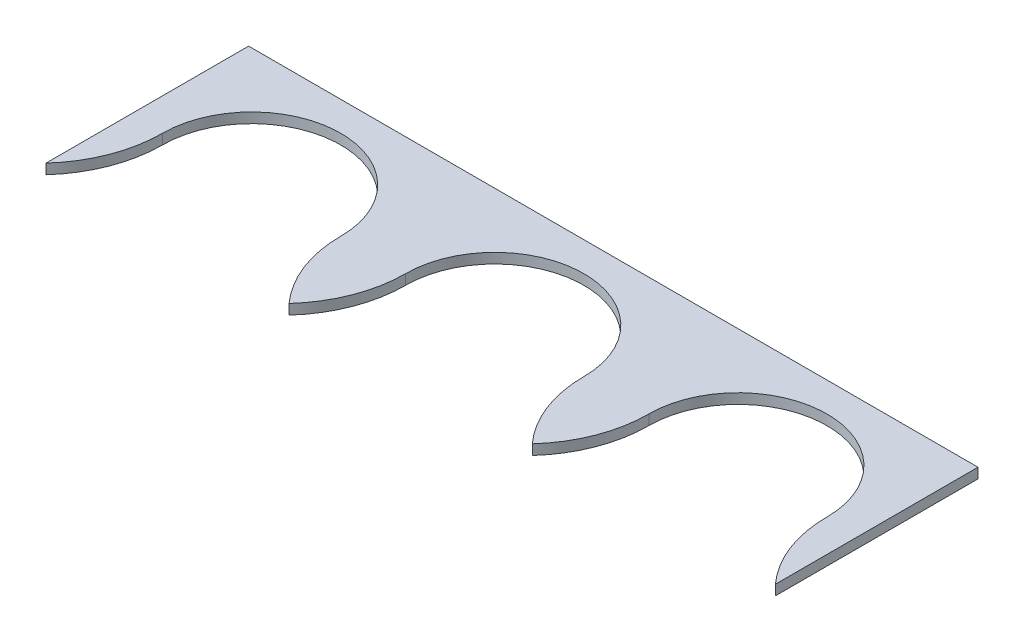
ISO-10303-21;
HEADER;
FILE_DESCRIPTION(('STEP AP214'),'2;1');
FILE_NAME('part.step','',(''),(''),'','','');
FILE_SCHEMA(('AUTOMOTIVE_DESIGN { 1 0 10303 214 1 1 1 1 }'));
ENDSEC;
DATA;
#1=APPLICATION_CONTEXT('core data for automotive mechanical design processes');
#2=APPLICATION_PROTOCOL_DEFINITION('international standard','automotive_design',2000,#1);
#3=PRODUCT_CONTEXT('',#1,'mechanical');
#4=PRODUCT('Part','Part','',(#3));
#5=PRODUCT_RELATED_PRODUCT_CATEGORY('part','',(#4));
#6=PRODUCT_DEFINITION_FORMATION('','',#4);
#7=PRODUCT_DEFINITION_CONTEXT('part definition',#1,'design');
#8=PRODUCT_DEFINITION('design','',#6,#7);
#9=PRODUCT_DEFINITION_SHAPE('','',#8);
#10=(LENGTH_UNIT() NAMED_UNIT(*) SI_UNIT(.MILLI.,.METRE.));
#11=(NAMED_UNIT(*) PLANE_ANGLE_UNIT() SI_UNIT($,.RADIAN.));
#12=(NAMED_UNIT(*) SI_UNIT($,.STERADIAN.) SOLID_ANGLE_UNIT());
#13=UNCERTAINTY_MEASURE_WITH_UNIT(LENGTH_MEASURE(1.E-05),#10,'distance_accuracy_value','');
#14=(GEOMETRIC_REPRESENTATION_CONTEXT(3) GLOBAL_UNCERTAINTY_ASSIGNED_CONTEXT((#13)) GLOBAL_UNIT_ASSIGNED_CONTEXT((#10,
#11,#12)) REPRESENTATION_CONTEXT('',''));
#15=CARTESIAN_POINT('',(0.,0.,0.));
#16=DIRECTION('',(0.,0.,1.));
#17=DIRECTION('',(1.,0.,0.));
#18=AXIS2_PLACEMENT_3D('',#15,#16,#17);
#19=CARTESIAN_POINT('',(-44.2941712464759,-6.35,34.3739942350874));
#20=DIRECTION('',(0.,1.,0.));
#21=DIRECTION('',(0.,0.,1.));
#22=AXIS2_PLACEMENT_3D('',#19,#20,#21);
#23=CYLINDRICAL_SURFACE('',#22,55.88);
#24=CARTESIAN_POINT('',(-44.2941712464759,0.,34.3739942350874));
#25=DIRECTION('',(0.,1.,0.));
#26=DIRECTION('',(0.,0.,1.));
#27=AXIS2_PLACEMENT_3D('',#24,#25,#26);
#28=CIRCLE('',#27,55.88);
#29=CARTESIAN_POINT('',(11.5858287535241,0.,34.3739942350875));
#30=VERTEX_POINT('',#29);
#31=CARTESIAN_POINT('',(-100.174171246476,0.,34.3739942350874));
#32=VERTEX_POINT('',#31);
#33=EDGE_CURVE('E153',#30,#32,#28,.T.);
#34=ORIENTED_EDGE('',*,*,#33,.T.);
#35=DIRECTION('',(0.,1.,0.));
#36=VECTOR('',#35,1.);
#37=CARTESIAN_POINT('',(-100.174171246476,-6.35,34.3739942350874));
#38=LINE('',#37,#36);
#39=CARTESIAN_POINT('',(-100.174171246476,-6.35,34.3739942350874));
#40=VERTEX_POINT('',#39);
#41=EDGE_CURVE('E11',#40,#32,#38,.T.);
#42=ORIENTED_EDGE('',*,*,#41,.F.);
#43=CARTESIAN_POINT('',(-44.2941712464759,-6.35,34.3739942350874));
#44=DIRECTION('',(0.,1.,0.));
#45=DIRECTION('',(0.,0.,1.));
#46=AXIS2_PLACEMENT_3D('',#43,#44,#45);
#47=CIRCLE('',#46,55.88);
#48=CARTESIAN_POINT('',(11.5858287535241,-6.35,34.3739942350875));
#49=VERTEX_POINT('',#48);
#50=EDGE_CURVE('E181',#49,#40,#47,.T.);
#51=ORIENTED_EDGE('',*,*,#50,.F.);
#52=DIRECTION('',(0.,1.,0.));
#53=VECTOR('',#52,1.);
#54=CARTESIAN_POINT('',(11.5858287535241,-6.35,34.3739942350875));
#55=LINE('',#54,#53);
#56=EDGE_CURVE('E38',#49,#30,#55,.T.);
#57=ORIENTED_EDGE('',*,*,#56,.T.);
#58=EDGE_LOOP('',(#34,#42,#51,#57));
#59=FACE_BOUND('',#58,.T.);
#60=ADVANCED_FACE('F35',(#59),#23,.F.);
#61=CARTESIAN_POINT('',(-178.685968121476,-6.35,34.3739942350874));
#62=DIRECTION('',(0.,1.,0.));
#63=DIRECTION('',(0.,0.,1.));
#64=AXIS2_PLACEMENT_3D('',#61,#62,#63);
#65=CYLINDRICAL_SURFACE('',#64,78.5117968749999);
#66=CARTESIAN_POINT('',(-178.685968121476,0.,34.3739942350874));
#67=DIRECTION('',(0.,1.,0.));
#68=DIRECTION('',(0.,0.,1.));
#69=AXIS2_PLACEMENT_3D('',#66,#67,#68);
#70=CIRCLE('',#69,78.5117968749999);
#71=CARTESIAN_POINT('',(-120.494171246476,0.,87.0789942350874));
#72=VERTEX_POINT('',#71);
#73=EDGE_CURVE('E98',#32,#72,#70,.F.);
#74=ORIENTED_EDGE('',*,*,#73,.T.);
#75=DIRECTION('',(0.,1.,0.));
#76=VECTOR('',#75,1.);
#77=CARTESIAN_POINT('',(-120.494171246476,-6.35,87.0789942350874));
#78=LINE('',#77,#76);
#79=CARTESIAN_POINT('',(-120.494171246476,-6.35,87.0789942350874));
#80=VERTEX_POINT('',#79);
#81=EDGE_CURVE('E44',#80,#72,#78,.T.);
#82=ORIENTED_EDGE('',*,*,#81,.F.);
#83=CARTESIAN_POINT('',(-178.685968121476,-6.35,34.3739942350874));
#84=DIRECTION('',(0.,1.,0.));
#85=DIRECTION('',(0.,0.,1.));
#86=AXIS2_PLACEMENT_3D('',#83,#84,#85);
#87=CIRCLE('',#86,78.5117968749999);
#88=EDGE_CURVE('E52',#40,#80,#87,.F.);
#89=ORIENTED_EDGE('',*,*,#88,.F.);
#90=ORIENTED_EDGE('',*,*,#41,.T.);
#91=EDGE_LOOP('',(#74,#82,#89,#90));
#92=FACE_BOUND('',#91,.T.);
#93=ADVANCED_FACE('F217',(#92),#65,.T.);
#94=CARTESIAN_POINT('',(-120.494171246476,-6.35,25.1664942350875));
#95=DIRECTION('',(-1.,0.,0.));
#96=DIRECTION('',(0.,0.,1.));
#97=AXIS2_PLACEMENT_3D('',#94,#95,#96);
#98=PLANE('',#97);
#99=DIRECTION('',(0.,0.,1.));
#100=VECTOR('',#99,1.);
#101=CARTESIAN_POINT('',(-120.494171246476,0.,25.1664942350875));
#102=LINE('',#101,#100);
#103=CARTESIAN_POINT('',(-120.494171246476,0.,-39.9210057649125));
#104=VERTEX_POINT('',#103);
#105=EDGE_CURVE('E135',#104,#72,#102,.T.);
#106=ORIENTED_EDGE('',*,*,#105,.F.);
#107=DIRECTION('',(0.,1.,0.));
#108=VECTOR('',#107,1.);
#109=CARTESIAN_POINT('',(-120.494171246476,-6.35,-39.9210057649125));
#110=LINE('',#109,#108);
#111=CARTESIAN_POINT('',(-120.494171246476,-6.35,-39.9210057649125));
#112=VERTEX_POINT('',#111);
#113=EDGE_CURVE('E130',#112,#104,#110,.T.);
#114=ORIENTED_EDGE('',*,*,#113,.F.);
#115=DIRECTION('',(0.,0.,1.));
#116=VECTOR('',#115,1.);
#117=CARTESIAN_POINT('',(-120.494171246476,-6.35,25.1664942350875));
#118=LINE('',#117,#116);
#119=EDGE_CURVE('E134',#112,#80,#118,.T.);
#120=ORIENTED_EDGE('',*,*,#119,.T.);
#121=ORIENTED_EDGE('',*,*,#81,.T.);
#122=EDGE_LOOP('',(#106,#114,#120,#121));
#123=FACE_BOUND('',#122,.T.);
#124=ADVANCED_FACE('F132',(#123),#98,.T.);
#125=CARTESIAN_POINT('',(-261.787278505733,-6.35,-39.9210057649125));
#126=DIRECTION('',(0.,0.,1.));
#127=DIRECTION('',(1.,0.,0.));
#128=AXIS2_PLACEMENT_3D('',#125,#126,#127);
#129=PLANE('',#128);
#130=DIRECTION('',(1.,0.,0.));
#131=VECTOR('',#130,1.);
#132=CARTESIAN_POINT('',(-261.787278505733,0.,-39.9210057649125));
#133=LINE('',#132,#131);
#134=CARTESIAN_POINT('',(336.705828753524,0.,-39.9210057649125));
#135=VERTEX_POINT('',#134);
#136=EDGE_CURVE('E178',#104,#135,#133,.T.);
#137=ORIENTED_EDGE('',*,*,#136,.T.);
#138=DIRECTION('',(0.,1.,0.));
#139=VECTOR('',#138,1.);
#140=CARTESIAN_POINT('',(336.705828753524,-6.35,-39.9210057649125));
#141=LINE('',#140,#139);
#142=CARTESIAN_POINT('',(336.705828753524,-6.35,-39.9210057649125));
#143=VERTEX_POINT('',#142);
#144=EDGE_CURVE('E138',#143,#135,#141,.T.);
#145=ORIENTED_EDGE('',*,*,#144,.F.);
#146=DIRECTION('',(1.,0.,0.));
#147=VECTOR('',#146,1.);
#148=CARTESIAN_POINT('',(-261.787278505733,-6.35,-39.9210057649125));
#149=LINE('',#148,#147);
#150=EDGE_CURVE('E141',#112,#143,#149,.T.);
#151=ORIENTED_EDGE('',*,*,#150,.F.);
#152=ORIENTED_EDGE('',*,*,#113,.T.);
#153=EDGE_LOOP('',(#137,#145,#151,#152));
#154=FACE_BOUND('',#153,.T.);
#155=ADVANCED_FACE('F142',(#154),#129,.F.);
#156=CARTESIAN_POINT('',(336.705828753524,-6.35,25.1664942350875));
#157=DIRECTION('',(-1.,0.,0.));
#158=DIRECTION('',(0.,0.,1.));
#159=AXIS2_PLACEMENT_3D('',#156,#157,#158);
#160=PLANE('',#159);
#161=DIRECTION('',(0.,0.,1.));
#162=VECTOR('',#161,1.);
#163=CARTESIAN_POINT('',(336.705828753524,0.,25.1664942350875));
#164=LINE('',#163,#162);
#165=CARTESIAN_POINT('',(336.705828753524,0.,87.0789942350875));
#166=VERTEX_POINT('',#165);
#167=EDGE_CURVE('E175',#135,#166,#164,.T.);
#168=ORIENTED_EDGE('',*,*,#167,.T.);
#169=DIRECTION('',(0.,1.,0.));
#170=VECTOR('',#169,1.);
#171=CARTESIAN_POINT('',(336.705828753524,-6.35,87.0789942350875));
#172=LINE('',#171,#170);
#173=CARTESIAN_POINT('',(336.705828753524,-6.35,87.0789942350875));
#174=VERTEX_POINT('',#173);
#175=EDGE_CURVE('E185',#174,#166,#172,.T.);
#176=ORIENTED_EDGE('',*,*,#175,.F.);
#177=DIRECTION('',(0.,0.,1.));
#178=VECTOR('',#177,1.);
#179=CARTESIAN_POINT('',(336.705828753524,-6.35,25.1664942350875));
#180=LINE('',#179,#178);
#181=EDGE_CURVE('E146',#143,#174,#180,.T.);
#182=ORIENTED_EDGE('',*,*,#181,.F.);
#183=ORIENTED_EDGE('',*,*,#144,.T.);
#184=EDGE_LOOP('',(#168,#176,#182,#183));
#185=FACE_BOUND('',#184,.T.);
#186=ADVANCED_FACE('F230',(#185),#160,.F.);
#187=CARTESIAN_POINT('',(394.897625628524,-6.35,34.3739942350875));
#188=DIRECTION('',(0.,1.,0.));
#189=DIRECTION('',(0.,0.,1.));
#190=AXIS2_PLACEMENT_3D('',#187,#188,#189);
#191=CYLINDRICAL_SURFACE('',#190,78.5117968750001);
#192=CARTESIAN_POINT('',(394.897625628524,0.,34.3739942350875));
#193=DIRECTION('',(0.,1.,0.));
#194=DIRECTION('',(0.,0.,1.));
#195=AXIS2_PLACEMENT_3D('',#192,#193,#194);
#196=CIRCLE('',#195,78.5117968750001);
#197=CARTESIAN_POINT('',(316.385828753524,0.,34.3739942350875));
#198=VERTEX_POINT('',#197);
#199=EDGE_CURVE('E172',#198,#166,#196,.T.);
#200=ORIENTED_EDGE('',*,*,#199,.F.);
#201=DIRECTION('',(0.,1.,0.));
#202=VECTOR('',#201,1.);
#203=CARTESIAN_POINT('',(316.385828753524,-6.35,34.3739942350875));
#204=LINE('',#203,#202);
#205=CARTESIAN_POINT('',(316.385828753524,-6.35,34.3739942350875));
#206=VERTEX_POINT('',#205);
#207=EDGE_CURVE('E187',#206,#198,#204,.T.);
#208=ORIENTED_EDGE('',*,*,#207,.F.);
#209=CARTESIAN_POINT('',(394.897625628524,-6.35,34.3739942350875));
#210=DIRECTION('',(0.,1.,0.));
#211=DIRECTION('',(0.,0.,1.));
#212=AXIS2_PLACEMENT_3D('',#209,#210,#211);
#213=CIRCLE('',#212,78.5117968750001);
#214=EDGE_CURVE('E274',#206,#174,#213,.T.);
#215=ORIENTED_EDGE('',*,*,#214,.T.);
#216=ORIENTED_EDGE('',*,*,#175,.T.);
#217=EDGE_LOOP('',(#200,#208,#215,#216));
#218=FACE_BOUND('',#217,.T.);
#219=ADVANCED_FACE('F233',(#218),#191,.T.);
#220=CARTESIAN_POINT('',(260.505828753524,-6.35,34.3739942350874));
#221=DIRECTION('',(0.,1.,0.));
#222=DIRECTION('',(0.,0.,1.));
#223=AXIS2_PLACEMENT_3D('',#220,#221,#222);
#224=CYLINDRICAL_SURFACE('',#223,55.88);
#225=CARTESIAN_POINT('',(260.505828753524,0.,34.3739942350874));
#226=DIRECTION('',(0.,1.,0.));
#227=DIRECTION('',(0.,0.,1.));
#228=AXIS2_PLACEMENT_3D('',#225,#226,#227);
#229=CIRCLE('',#228,55.88);
#230=CARTESIAN_POINT('',(204.625828753524,0.,34.3739942350874));
#231=VERTEX_POINT('',#230);
#232=EDGE_CURVE('E170',#198,#231,#229,.T.);
#233=ORIENTED_EDGE('',*,*,#232,.T.);
#234=DIRECTION('',(0.,1.,0.));
#235=VECTOR('',#234,1.);
#236=CARTESIAN_POINT('',(204.625828753524,-6.35,34.3739942350874));
#237=LINE('',#236,#235);
#238=CARTESIAN_POINT('',(204.625828753524,-6.35,34.3739942350874));
#239=VERTEX_POINT('',#238);
#240=EDGE_CURVE('E189',#239,#231,#237,.T.);
#241=ORIENTED_EDGE('',*,*,#240,.F.);
#242=CARTESIAN_POINT('',(260.505828753524,-6.35,34.3739942350874));
#243=DIRECTION('',(0.,1.,0.));
#244=DIRECTION('',(0.,0.,1.));
#245=AXIS2_PLACEMENT_3D('',#242,#243,#244);
#246=CIRCLE('',#245,55.88);
#247=EDGE_CURVE('E272',#206,#239,#246,.T.);
#248=ORIENTED_EDGE('',*,*,#247,.F.);
#249=ORIENTED_EDGE('',*,*,#207,.T.);
#250=EDGE_LOOP('',(#233,#241,#248,#249));
#251=FACE_BOUND('',#250,.T.);
#252=ADVANCED_FACE('F237',(#251),#224,.F.);
#253=CARTESIAN_POINT('',(126.114031878524,-6.35,34.3739942350875));
#254=DIRECTION('',(0.,1.,0.));
#255=DIRECTION('',(0.,0.,1.));
#256=AXIS2_PLACEMENT_3D('',#253,#254,#255);
#257=CYLINDRICAL_SURFACE('',#256,78.5117968750001);
#258=CARTESIAN_POINT('',(126.114031878524,0.,34.3739942350875));
#259=DIRECTION('',(0.,1.,0.));
#260=DIRECTION('',(0.,0.,1.));
#261=AXIS2_PLACEMENT_3D('',#258,#259,#260);
#262=CIRCLE('',#261,78.5117968750001);
#263=CARTESIAN_POINT('',(184.305828753524,0.,87.0789942350874));
#264=VERTEX_POINT('',#263);
#265=EDGE_CURVE('E167',#231,#264,#262,.F.);
#266=ORIENTED_EDGE('',*,*,#265,.T.);
#267=DIRECTION('',(0.,1.,0.));
#268=VECTOR('',#267,1.);
#269=CARTESIAN_POINT('',(184.305828753524,-6.35,87.0789942350874));
#270=LINE('',#269,#268);
#271=CARTESIAN_POINT('',(184.305828753524,-6.35,87.0789942350874));
#272=VERTEX_POINT('',#271);
#273=EDGE_CURVE('E192',#272,#264,#270,.T.);
#274=ORIENTED_EDGE('',*,*,#273,.F.);
#275=CARTESIAN_POINT('',(126.114031878524,-6.35,34.3739942350875));
#276=DIRECTION('',(0.,1.,0.));
#277=DIRECTION('',(0.,0.,1.));
#278=AXIS2_PLACEMENT_3D('',#275,#276,#277);
#279=CIRCLE('',#278,78.5117968750001);
#280=EDGE_CURVE('E270',#239,#272,#279,.F.);
#281=ORIENTED_EDGE('',*,*,#280,.F.);
#282=ORIENTED_EDGE('',*,*,#240,.T.);
#283=EDGE_LOOP('',(#266,#274,#281,#282));
#284=FACE_BOUND('',#283,.T.);
#285=ADVANCED_FACE('F241',(#284),#257,.T.);
#286=CARTESIAN_POINT('',(242.497625628524,-6.35,34.3739942350874));
#287=DIRECTION('',(0.,1.,0.));
#288=DIRECTION('',(0.,0.,1.));
#289=AXIS2_PLACEMENT_3D('',#286,#287,#288);
#290=CYLINDRICAL_SURFACE('',#289,78.5117968750001);
#291=CARTESIAN_POINT('',(242.497625628524,0.,34.3739942350874));
#292=DIRECTION('',(0.,1.,0.));
#293=DIRECTION('',(0.,0.,1.));
#294=AXIS2_PLACEMENT_3D('',#291,#292,#293);
#295=CIRCLE('',#294,78.5117968750001);
#296=CARTESIAN_POINT('',(163.985828753524,0.,34.3739942350874));
#297=VERTEX_POINT('',#296);
#298=EDGE_CURVE('E164',#297,#264,#295,.T.);
#299=ORIENTED_EDGE('',*,*,#298,.F.);
#300=DIRECTION('',(0.,1.,0.));
#301=VECTOR('',#300,1.);
#302=CARTESIAN_POINT('',(163.985828753524,-6.35,34.3739942350874));
#303=LINE('',#302,#301);
#304=CARTESIAN_POINT('',(163.985828753524,-6.35,34.3739942350874));
#305=VERTEX_POINT('',#304);
#306=EDGE_CURVE('E194',#305,#297,#303,.T.);
#307=ORIENTED_EDGE('',*,*,#306,.F.);
#308=CARTESIAN_POINT('',(242.497625628524,-6.35,34.3739942350874));
#309=DIRECTION('',(0.,1.,0.));
#310=DIRECTION('',(0.,0.,1.));
#311=AXIS2_PLACEMENT_3D('',#308,#309,#310);
#312=CIRCLE('',#311,78.5117968750001);
#313=EDGE_CURVE('E263',#305,#272,#312,.T.);
#314=ORIENTED_EDGE('',*,*,#313,.T.);
#315=ORIENTED_EDGE('',*,*,#273,.T.);
#316=EDGE_LOOP('',(#299,#307,#314,#315));
#317=FACE_BOUND('',#316,.T.);
#318=ADVANCED_FACE('F245',(#317),#290,.T.);
#319=CARTESIAN_POINT('',(108.105828753524,-6.35,34.3739942350874));
#320=DIRECTION('',(0.,1.,0.));
#321=DIRECTION('',(0.,0.,1.));
#322=AXIS2_PLACEMENT_3D('',#319,#320,#321);
#323=CYLINDRICAL_SURFACE('',#322,55.88);
#324=CARTESIAN_POINT('',(108.105828753524,0.,34.3739942350874));
#325=DIRECTION('',(0.,1.,0.));
#326=DIRECTION('',(0.,0.,1.));
#327=AXIS2_PLACEMENT_3D('',#324,#325,#326);
#328=CIRCLE('',#327,55.88);
#329=CARTESIAN_POINT('',(52.2258287535241,0.,34.3739942350875));
#330=VERTEX_POINT('',#329);
#331=EDGE_CURVE('E162',#297,#330,#328,.T.);
#332=ORIENTED_EDGE('',*,*,#331,.T.);
#333=DIRECTION('',(0.,1.,0.));
#334=VECTOR('',#333,1.);
#335=CARTESIAN_POINT('',(52.2258287535241,-6.35,34.3739942350875));
#336=LINE('',#335,#334);
#337=CARTESIAN_POINT('',(52.2258287535241,-6.35,34.3739942350875));
#338=VERTEX_POINT('',#337);
#339=EDGE_CURVE('E196',#338,#330,#336,.T.);
#340=ORIENTED_EDGE('',*,*,#339,.F.);
#341=CARTESIAN_POINT('',(108.105828753524,-6.35,34.3739942350874));
#342=DIRECTION('',(0.,1.,0.));
#343=DIRECTION('',(0.,0.,1.));
#344=AXIS2_PLACEMENT_3D('',#341,#342,#343);
#345=CIRCLE('',#344,55.88);
#346=EDGE_CURVE('E260',#305,#338,#345,.T.);
#347=ORIENTED_EDGE('',*,*,#346,.F.);
#348=ORIENTED_EDGE('',*,*,#306,.T.);
#349=EDGE_LOOP('',(#332,#340,#347,#348));
#350=FACE_BOUND('',#349,.T.);
#351=ADVANCED_FACE('F213',(#350),#323,.F.);
#352=CARTESIAN_POINT('',(-26.2859681214758,-6.35,34.3739942350875));
#353=DIRECTION('',(0.,1.,0.));
#354=DIRECTION('',(0.,0.,1.));
#355=AXIS2_PLACEMENT_3D('',#352,#353,#354);
#356=CYLINDRICAL_SURFACE('',#355,78.5117968749999);
#357=CARTESIAN_POINT('',(-26.2859681214758,0.,34.3739942350875));
#358=DIRECTION('',(0.,1.,0.));
#359=DIRECTION('',(0.,0.,1.));
#360=AXIS2_PLACEMENT_3D('',#357,#358,#359);
#361=CIRCLE('',#360,78.5117968749999);
#362=CARTESIAN_POINT('',(31.905828753524,0.,87.0789942350875));
#363=VERTEX_POINT('',#362);
#364=EDGE_CURVE('E159',#330,#363,#361,.F.);
#365=ORIENTED_EDGE('',*,*,#364,.T.);
#366=DIRECTION('',(0.,1.,0.));
#367=VECTOR('',#366,1.);
#368=CARTESIAN_POINT('',(31.905828753524,-6.35,87.0789942350875));
#369=LINE('',#368,#367);
#370=CARTESIAN_POINT('',(31.905828753524,-6.35,87.0789942350875));
#371=VERTEX_POINT('',#370);
#372=EDGE_CURVE('E198',#371,#363,#369,.T.);
#373=ORIENTED_EDGE('',*,*,#372,.F.);
#374=CARTESIAN_POINT('',(-26.2859681214758,-6.35,34.3739942350875));
#375=DIRECTION('',(0.,1.,0.));
#376=DIRECTION('',(0.,0.,1.));
#377=AXIS2_PLACEMENT_3D('',#374,#375,#376);
#378=CIRCLE('',#377,78.5117968749999);
#379=EDGE_CURVE('E259',#338,#371,#378,.F.);
#380=ORIENTED_EDGE('',*,*,#379,.F.);
#381=ORIENTED_EDGE('',*,*,#339,.T.);
#382=EDGE_LOOP('',(#365,#373,#380,#381));
#383=FACE_BOUND('',#382,.T.);
#384=ADVANCED_FACE('F207',(#383),#356,.T.);
#385=CARTESIAN_POINT('',(90.0976256285237,-6.35,34.3739942350876));
#386=DIRECTION('',(0.,1.,0.));
#387=DIRECTION('',(0.,0.,1.));
#388=AXIS2_PLACEMENT_3D('',#385,#386,#387);
#389=CYLINDRICAL_SURFACE('',#388,78.5117968749996);
#390=CARTESIAN_POINT('',(90.0976256285237,0.,34.3739942350876));
#391=DIRECTION('',(0.,1.,0.));
#392=DIRECTION('',(0.,0.,1.));
#393=AXIS2_PLACEMENT_3D('',#390,#391,#392);
#394=CIRCLE('',#393,78.5117968749996);
#395=EDGE_CURVE('E156',#30,#363,#394,.T.);
#396=ORIENTED_EDGE('',*,*,#395,.F.);
#397=ORIENTED_EDGE('',*,*,#56,.F.);
#398=CARTESIAN_POINT('',(90.0976256285237,-6.35,34.3739942350876));
#399=DIRECTION('',(0.,1.,0.));
#400=DIRECTION('',(0.,0.,1.));
#401=AXIS2_PLACEMENT_3D('',#398,#399,#400);
#402=CIRCLE('',#401,78.5117968749996);
#403=EDGE_CURVE('E261',#49,#371,#402,.T.);
#404=ORIENTED_EDGE('',*,*,#403,.T.);
#405=ORIENTED_EDGE('',*,*,#372,.T.);
#406=EDGE_LOOP('',(#396,#397,#404,#405));
#407=FACE_BOUND('',#406,.T.);
#408=ADVANCED_FACE('F205',(#407),#389,.T.);
#409=CARTESIAN_POINT('',(-261.787278505733,-6.35,25.1664942350875));
#410=DIRECTION('',(0.,1.,0.));
#411=DIRECTION('',(0.,0.,1.));
#412=AXIS2_PLACEMENT_3D('',#409,#410,#411);
#413=PLANE('',#412);
#414=ORIENTED_EDGE('',*,*,#50,.T.);
#415=ORIENTED_EDGE('',*,*,#88,.T.);
#416=ORIENTED_EDGE('',*,*,#119,.F.);
#417=ORIENTED_EDGE('',*,*,#150,.T.);
#418=ORIENTED_EDGE('',*,*,#181,.T.);
#419=ORIENTED_EDGE('',*,*,#214,.F.);
#420=ORIENTED_EDGE('',*,*,#247,.T.);
#421=ORIENTED_EDGE('',*,*,#280,.T.);
#422=ORIENTED_EDGE('',*,*,#313,.F.);
#423=ORIENTED_EDGE('',*,*,#346,.T.);
#424=ORIENTED_EDGE('',*,*,#379,.T.);
#425=ORIENTED_EDGE('',*,*,#403,.F.);
#426=EDGE_LOOP('',(#414,#415,#416,#417,#418,#419,#420,#421,#422,#423,#424,#425));
#427=FACE_BOUND('',#426,.T.);
#428=ADVANCED_FACE('F148',(#427),#413,.F.);
#429=CARTESIAN_POINT('',(-261.787278505733,0.,25.1664942350875));
#430=DIRECTION('',(0.,1.,0.));
#431=DIRECTION('',(0.,0.,1.));
#432=AXIS2_PLACEMENT_3D('',#429,#430,#431);
#433=PLANE('',#432);
#434=ORIENTED_EDGE('',*,*,#33,.F.);
#435=ORIENTED_EDGE('',*,*,#395,.T.);
#436=ORIENTED_EDGE('',*,*,#364,.F.);
#437=ORIENTED_EDGE('',*,*,#331,.F.);
#438=ORIENTED_EDGE('',*,*,#298,.T.);
#439=ORIENTED_EDGE('',*,*,#265,.F.);
#440=ORIENTED_EDGE('',*,*,#232,.F.);
#441=ORIENTED_EDGE('',*,*,#199,.T.);
#442=ORIENTED_EDGE('',*,*,#167,.F.);
#443=ORIENTED_EDGE('',*,*,#136,.F.);
#444=ORIENTED_EDGE('',*,*,#105,.T.);
#445=ORIENTED_EDGE('',*,*,#73,.F.);
#446=EDGE_LOOP('',(#434,#435,#436,#437,#438,#439,#440,#441,#442,#443,#444,#445));
#447=FACE_BOUND('',#446,.T.);
#448=ADVANCED_FACE('F203',(#447),#433,.T.);
#449=CLOSED_SHELL('',(#60,#93,#124,#155,#186,#219,#252,#285,#318,#351,#384,#408,#428,#448));
#450=MANIFOLD_SOLID_BREP('B2',#449);
#451=ADVANCED_BREP_SHAPE_REPRESENTATION('',(#18,#450),#14);
#452=SHAPE_DEFINITION_REPRESENTATION(#9,#451);
ENDSEC;
END-ISO-10303-21;
